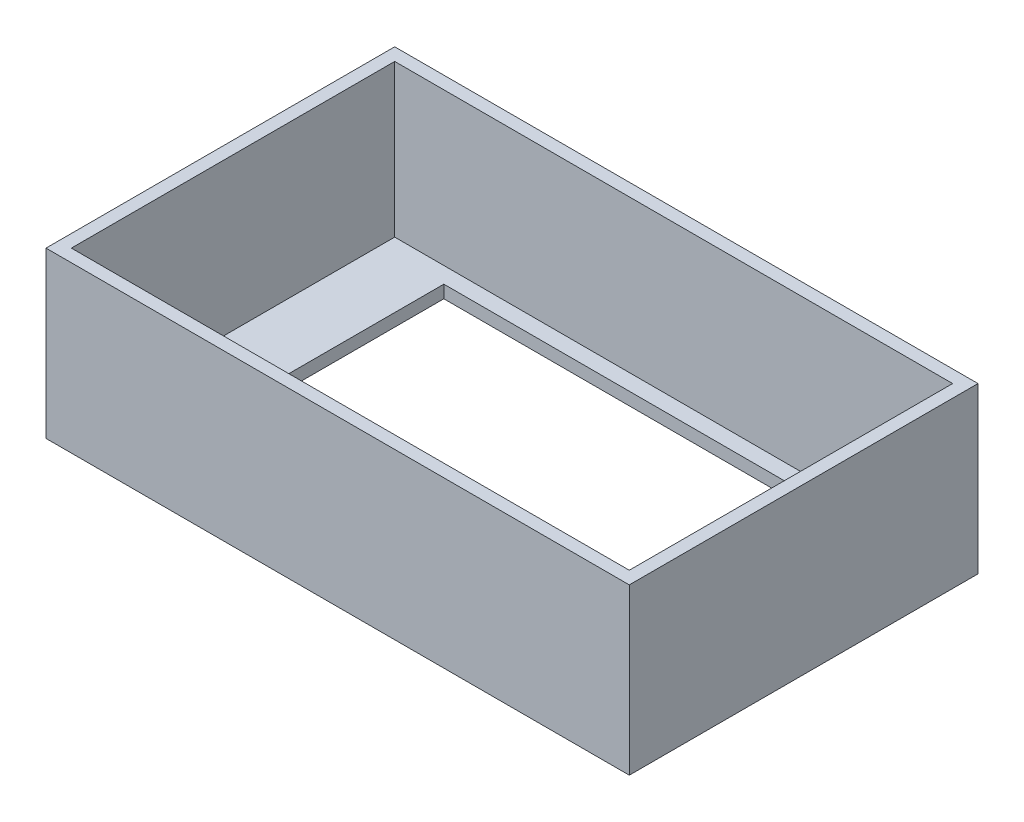
ISO-10303-21;
HEADER;
FILE_DESCRIPTION(('STEP AP214'),'2;1');
FILE_NAME('part.step','',(''),(''),'','','');
FILE_SCHEMA(('AUTOMOTIVE_DESIGN { 1 0 10303 214 1 1 1 1 }'));
ENDSEC;
DATA;
#1=APPLICATION_CONTEXT('core data for automotive mechanical design processes');
#2=APPLICATION_PROTOCOL_DEFINITION('international standard','automotive_design',2000,#1);
#3=PRODUCT_CONTEXT('',#1,'mechanical');
#4=PRODUCT('Part','Part','',(#3));
#5=PRODUCT_RELATED_PRODUCT_CATEGORY('part','',(#4));
#6=PRODUCT_DEFINITION_FORMATION('','',#4);
#7=PRODUCT_DEFINITION_CONTEXT('part definition',#1,'design');
#8=PRODUCT_DEFINITION('design','',#6,#7);
#9=PRODUCT_DEFINITION_SHAPE('','',#8);
#10=(LENGTH_UNIT() NAMED_UNIT(*) SI_UNIT(.MILLI.,.METRE.));
#11=(NAMED_UNIT(*) PLANE_ANGLE_UNIT() SI_UNIT($,.RADIAN.));
#12=(NAMED_UNIT(*) SI_UNIT($,.STERADIAN.) SOLID_ANGLE_UNIT());
#13=UNCERTAINTY_MEASURE_WITH_UNIT(LENGTH_MEASURE(1.E-05),#10,'distance_accuracy_value','');
#14=(GEOMETRIC_REPRESENTATION_CONTEXT(3) GLOBAL_UNCERTAINTY_ASSIGNED_CONTEXT((#13)) GLOBAL_UNIT_ASSIGNED_CONTEXT((#10,
#11,#12)) REPRESENTATION_CONTEXT('',''));
#15=CARTESIAN_POINT('',(0.,0.,0.));
#16=DIRECTION('',(0.,0.,1.));
#17=DIRECTION('',(1.,0.,0.));
#18=AXIS2_PLACEMENT_3D('',#15,#16,#17);
#19=CARTESIAN_POINT('',(0.,2.,0.));
#20=DIRECTION('',(0.,1.,0.));
#21=DIRECTION('',(0.,0.,1.));
#22=AXIS2_PLACEMENT_3D('',#19,#20,#21);
#23=PLANE('',#22);
#24=DIRECTION('',(0.,0.,1.));
#25=VECTOR('',#24,1.);
#26=CARTESIAN_POINT('',(-44.,2.,-25.5));
#27=LINE('',#26,#25);
#28=CARTESIAN_POINT('',(-44.,2.,-25.5));
#29=VERTEX_POINT('',#28);
#30=CARTESIAN_POINT('',(-44.,2.00000000000001,25.5));
#31=VERTEX_POINT('',#30);
#32=EDGE_CURVE('E213',#29,#31,#27,.T.);
#33=ORIENTED_EDGE('',*,*,#32,.T.);
#34=DIRECTION('',(1.,0.,0.));
#35=VECTOR('',#34,1.);
#36=CARTESIAN_POINT('',(-44.,2.,25.5));
#37=LINE('',#36,#35);
#38=CARTESIAN_POINT('',(44.,2.00000000000001,25.5));
#39=VERTEX_POINT('',#38);
#40=EDGE_CURVE('E150',#31,#39,#37,.T.);
#41=ORIENTED_EDGE('',*,*,#40,.T.);
#42=DIRECTION('',(0.,0.,-1.));
#43=VECTOR('',#42,1.);
#44=CARTESIAN_POINT('',(44.,2.,-25.5));
#45=LINE('',#44,#43);
#46=CARTESIAN_POINT('',(44.,2.00000000000001,-25.5));
#47=VERTEX_POINT('',#46);
#48=EDGE_CURVE('E51',#39,#47,#45,.T.);
#49=ORIENTED_EDGE('',*,*,#48,.T.);
#50=DIRECTION('',(-1.,0.,0.));
#51=VECTOR('',#50,1.);
#52=CARTESIAN_POINT('',(-44.,2.,-25.5));
#53=LINE('',#52,#51);
#54=EDGE_CURVE('E11',#47,#29,#53,.T.);
#55=ORIENTED_EDGE('',*,*,#54,.T.);
#56=EDGE_LOOP('',(#33,#41,#49,#55));
#57=FACE_BOUND('',#56,.T.);
#58=DIRECTION('',(1.,0.,0.));
#59=VECTOR('',#58,1.);
#60=CARTESIAN_POINT('',(-33.7,2.,22.95));
#61=LINE('',#60,#59);
#62=CARTESIAN_POINT('',(-33.7,2.,22.95));
#63=VERTEX_POINT('',#62);
#64=CARTESIAN_POINT('',(26.5,2.,22.95));
#65=VERTEX_POINT('',#64);
#66=EDGE_CURVE('E214',#63,#65,#61,.T.);
#67=ORIENTED_EDGE('',*,*,#66,.F.);
#68=DIRECTION('',(0.,0.,1.));
#69=VECTOR('',#68,1.);
#70=CARTESIAN_POINT('',(-33.7,2.,-22.95));
#71=LINE('',#70,#69);
#72=CARTESIAN_POINT('',(-33.7,2.,-22.95));
#73=VERTEX_POINT('',#72);
#74=EDGE_CURVE('E217',#73,#63,#71,.T.);
#75=ORIENTED_EDGE('',*,*,#74,.F.);
#76=DIRECTION('',(-1.,0.,0.));
#77=VECTOR('',#76,1.);
#78=CARTESIAN_POINT('',(-33.7,2.,-22.95));
#79=LINE('',#78,#77);
#80=CARTESIAN_POINT('',(26.5,2.,-22.95));
#81=VERTEX_POINT('',#80);
#82=EDGE_CURVE('E201',#81,#73,#79,.T.);
#83=ORIENTED_EDGE('',*,*,#82,.F.);
#84=DIRECTION('',(0.,0.,-1.));
#85=VECTOR('',#84,1.);
#86=CARTESIAN_POINT('',(26.5,2.,-22.95));
#87=LINE('',#86,#85);
#88=EDGE_CURVE('E58',#65,#81,#87,.T.);
#89=ORIENTED_EDGE('',*,*,#88,.F.);
#90=EDGE_LOOP('',(#67,#75,#83,#89));
#91=FACE_BOUND('',#90,.T.);
#92=ADVANCED_FACE('F43',(#57,#91),#23,.T.);
#93=CARTESIAN_POINT('',(0.,0.,0.));
#94=DIRECTION('',(0.,1.,0.));
#95=DIRECTION('',(0.,0.,1.));
#96=AXIS2_PLACEMENT_3D('',#93,#94,#95);
#97=PLANE('',#96);
#98=DIRECTION('',(0.,0.,1.));
#99=VECTOR('',#98,1.);
#100=CARTESIAN_POINT('',(-33.7,0.,-22.95));
#101=LINE('',#100,#99);
#102=CARTESIAN_POINT('',(-33.7,0.,-22.95));
#103=VERTEX_POINT('',#102);
#104=CARTESIAN_POINT('',(-33.7,0.,22.95));
#105=VERTEX_POINT('',#104);
#106=EDGE_CURVE('E66',#103,#105,#101,.T.);
#107=ORIENTED_EDGE('',*,*,#106,.T.);
#108=DIRECTION('',(1.,0.,0.));
#109=VECTOR('',#108,1.);
#110=CARTESIAN_POINT('',(-33.7,0.,22.95));
#111=LINE('',#110,#109);
#112=CARTESIAN_POINT('',(26.5,0.,22.95));
#113=VERTEX_POINT('',#112);
#114=EDGE_CURVE('E207',#105,#113,#111,.T.);
#115=ORIENTED_EDGE('',*,*,#114,.T.);
#116=DIRECTION('',(0.,0.,-1.));
#117=VECTOR('',#116,1.);
#118=CARTESIAN_POINT('',(26.5,0.,-22.95));
#119=LINE('',#118,#117);
#120=CARTESIAN_POINT('',(26.5,0.,-22.95));
#121=VERTEX_POINT('',#120);
#122=EDGE_CURVE('E203',#113,#121,#119,.T.);
#123=ORIENTED_EDGE('',*,*,#122,.T.);
#124=DIRECTION('',(-1.,0.,0.));
#125=VECTOR('',#124,1.);
#126=CARTESIAN_POINT('',(-33.7,0.,-22.95));
#127=LINE('',#126,#125);
#128=EDGE_CURVE('E198',#121,#103,#127,.T.);
#129=ORIENTED_EDGE('',*,*,#128,.T.);
#130=EDGE_LOOP('',(#107,#115,#123,#129));
#131=FACE_BOUND('',#130,.T.);
#132=DIRECTION('',(-1.,0.,0.));
#133=VECTOR('',#132,1.);
#134=CARTESIAN_POINT('',(46.,0.,-27.5));
#135=LINE('',#134,#133);
#136=CARTESIAN_POINT('',(46.,0.,-27.5));
#137=VERTEX_POINT('',#136);
#138=CARTESIAN_POINT('',(-46.,0.,-27.5));
#139=VERTEX_POINT('',#138);
#140=EDGE_CURVE('E151',#137,#139,#135,.T.);
#141=ORIENTED_EDGE('',*,*,#140,.F.);
#142=DIRECTION('',(0.,0.,-1.));
#143=VECTOR('',#142,1.);
#144=CARTESIAN_POINT('',(46.,0.,27.5));
#145=LINE('',#144,#143);
#146=CARTESIAN_POINT('',(46.,0.,27.5));
#147=VERTEX_POINT('',#146);
#148=EDGE_CURVE('E172',#147,#137,#145,.T.);
#149=ORIENTED_EDGE('',*,*,#148,.F.);
#150=DIRECTION('',(1.,0.,0.));
#151=VECTOR('',#150,1.);
#152=CARTESIAN_POINT('',(-46.,0.,27.5));
#153=LINE('',#152,#151);
#154=CARTESIAN_POINT('',(-46.,0.,27.5));
#155=VERTEX_POINT('',#154);
#156=EDGE_CURVE('E183',#155,#147,#153,.T.);
#157=ORIENTED_EDGE('',*,*,#156,.F.);
#158=DIRECTION('',(0.,0.,1.));
#159=VECTOR('',#158,1.);
#160=CARTESIAN_POINT('',(-46.,0.,-27.5));
#161=LINE('',#160,#159);
#162=EDGE_CURVE('E181',#139,#155,#161,.T.);
#163=ORIENTED_EDGE('',*,*,#162,.F.);
#164=EDGE_LOOP('',(#141,#149,#157,#163));
#165=FACE_BOUND('',#164,.T.);
#166=ADVANCED_FACE('F45',(#131,#165),#97,.F.);
#167=CARTESIAN_POINT('',(-33.7,77.70237776979,-22.95));
#168=DIRECTION('',(1.,0.,0.));
#169=DIRECTION('',(0.,0.,-1.));
#170=AXIS2_PLACEMENT_3D('',#167,#168,#169);
#171=PLANE('',#170);
#172=ORIENTED_EDGE('',*,*,#74,.T.);
#173=DIRECTION('',(0.,-1.,0.));
#174=VECTOR('',#173,1.);
#175=CARTESIAN_POINT('',(-33.7,77.70237776979,22.95));
#176=LINE('',#175,#174);
#177=EDGE_CURVE('E210',#63,#105,#176,.T.);
#178=ORIENTED_EDGE('',*,*,#177,.T.);
#179=ORIENTED_EDGE('',*,*,#106,.F.);
#180=DIRECTION('',(0.,-1.,0.));
#181=VECTOR('',#180,1.);
#182=CARTESIAN_POINT('',(-33.7,77.70237776979,-22.95));
#183=LINE('',#182,#181);
#184=EDGE_CURVE('E197',#73,#103,#183,.T.);
#185=ORIENTED_EDGE('',*,*,#184,.F.);
#186=EDGE_LOOP('',(#172,#178,#179,#185));
#187=FACE_BOUND('',#186,.T.);
#188=ADVANCED_FACE('F244',(#187),#171,.T.);
#189=CARTESIAN_POINT('',(-33.7,77.70237776979,22.95));
#190=DIRECTION('',(0.,0.,-1.));
#191=DIRECTION('',(-1.,0.,0.));
#192=AXIS2_PLACEMENT_3D('',#189,#190,#191);
#193=PLANE('',#192);
#194=ORIENTED_EDGE('',*,*,#66,.T.);
#195=DIRECTION('',(0.,-1.,0.));
#196=VECTOR('',#195,1.);
#197=CARTESIAN_POINT('',(26.5,77.70237776979,22.95));
#198=LINE('',#197,#196);
#199=EDGE_CURVE('E206',#65,#113,#198,.T.);
#200=ORIENTED_EDGE('',*,*,#199,.T.);
#201=ORIENTED_EDGE('',*,*,#114,.F.);
#202=ORIENTED_EDGE('',*,*,#177,.F.);
#203=EDGE_LOOP('',(#194,#200,#201,#202));
#204=FACE_BOUND('',#203,.T.);
#205=ADVANCED_FACE('F249',(#204),#193,.T.);
#206=CARTESIAN_POINT('',(26.5,77.70237776979,-22.95));
#207=DIRECTION('',(-1.,0.,0.));
#208=DIRECTION('',(0.,0.,1.));
#209=AXIS2_PLACEMENT_3D('',#206,#207,#208);
#210=PLANE('',#209);
#211=ORIENTED_EDGE('',*,*,#88,.T.);
#212=DIRECTION('',(0.,-1.,0.));
#213=VECTOR('',#212,1.);
#214=CARTESIAN_POINT('',(26.5,77.70237776979,-22.95));
#215=LINE('',#214,#213);
#216=EDGE_CURVE('E202',#81,#121,#215,.T.);
#217=ORIENTED_EDGE('',*,*,#216,.T.);
#218=ORIENTED_EDGE('',*,*,#122,.F.);
#219=ORIENTED_EDGE('',*,*,#199,.F.);
#220=EDGE_LOOP('',(#211,#217,#218,#219));
#221=FACE_BOUND('',#220,.T.);
#222=ADVANCED_FACE('F252',(#221),#210,.T.);
#223=CARTESIAN_POINT('',(-33.7,77.70237776979,-22.95));
#224=DIRECTION('',(0.,0.,1.));
#225=DIRECTION('',(1.,0.,0.));
#226=AXIS2_PLACEMENT_3D('',#223,#224,#225);
#227=PLANE('',#226);
#228=ORIENTED_EDGE('',*,*,#82,.T.);
#229=ORIENTED_EDGE('',*,*,#184,.T.);
#230=ORIENTED_EDGE('',*,*,#128,.F.);
#231=ORIENTED_EDGE('',*,*,#216,.F.);
#232=EDGE_LOOP('',(#228,#229,#230,#231));
#233=FACE_BOUND('',#232,.T.);
#234=ADVANCED_FACE('F256',(#233),#227,.T.);
#235=CARTESIAN_POINT('',(0.,26.,0.));
#236=DIRECTION('',(0.,1.,0.));
#237=DIRECTION('',(0.,0.,1.));
#238=AXIS2_PLACEMENT_3D('',#235,#236,#237);
#239=PLANE('',#238);
#240=DIRECTION('',(-1.,0.,0.));
#241=VECTOR('',#240,1.);
#242=CARTESIAN_POINT('',(46.,26.,-27.5));
#243=LINE('',#242,#241);
#244=CARTESIAN_POINT('',(46.,26.,-27.5));
#245=VERTEX_POINT('',#244);
#246=CARTESIAN_POINT('',(-46.,26.,-27.5));
#247=VERTEX_POINT('',#246);
#248=EDGE_CURVE('E168',#245,#247,#243,.T.);
#249=ORIENTED_EDGE('',*,*,#248,.T.);
#250=DIRECTION('',(0.,0.,1.));
#251=VECTOR('',#250,1.);
#252=CARTESIAN_POINT('',(-46.,26.,-27.5));
#253=LINE('',#252,#251);
#254=CARTESIAN_POINT('',(-46.,26.,27.5));
#255=VERTEX_POINT('',#254);
#256=EDGE_CURVE('E171',#247,#255,#253,.T.);
#257=ORIENTED_EDGE('',*,*,#256,.T.);
#258=DIRECTION('',(1.,0.,0.));
#259=VECTOR('',#258,1.);
#260=CARTESIAN_POINT('',(-46.,26.,27.5));
#261=LINE('',#260,#259);
#262=CARTESIAN_POINT('',(46.,26.,27.5));
#263=VERTEX_POINT('',#262);
#264=EDGE_CURVE('E174',#255,#263,#261,.T.);
#265=ORIENTED_EDGE('',*,*,#264,.T.);
#266=DIRECTION('',(0.,0.,-1.));
#267=VECTOR('',#266,1.);
#268=CARTESIAN_POINT('',(46.,26.,27.5));
#269=LINE('',#268,#267);
#270=EDGE_CURVE('E176',#263,#245,#269,.T.);
#271=ORIENTED_EDGE('',*,*,#270,.T.);
#272=EDGE_LOOP('',(#249,#257,#265,#271));
#273=FACE_BOUND('',#272,.T.);
#274=DIRECTION('',(1.,0.,0.));
#275=VECTOR('',#274,1.);
#276=CARTESIAN_POINT('',(-44.,26.,25.5));
#277=LINE('',#276,#275);
#278=CARTESIAN_POINT('',(-44.,26.,25.5));
#279=VERTEX_POINT('',#278);
#280=CARTESIAN_POINT('',(44.,26.,25.5));
#281=VERTEX_POINT('',#280);
#282=EDGE_CURVE('E143',#279,#281,#277,.T.);
#283=ORIENTED_EDGE('',*,*,#282,.F.);
#284=DIRECTION('',(0.,0.,1.));
#285=VECTOR('',#284,1.);
#286=CARTESIAN_POINT('',(-44.,26.,-25.5));
#287=LINE('',#286,#285);
#288=CARTESIAN_POINT('',(-44.,26.,-25.5));
#289=VERTEX_POINT('',#288);
#290=EDGE_CURVE('E133',#289,#279,#287,.T.);
#291=ORIENTED_EDGE('',*,*,#290,.F.);
#292=DIRECTION('',(-1.,0.,0.));
#293=VECTOR('',#292,1.);
#294=CARTESIAN_POINT('',(44.,26.,-25.5));
#295=LINE('',#294,#293);
#296=CARTESIAN_POINT('',(44.,26.,-25.5));
#297=VERTEX_POINT('',#296);
#298=EDGE_CURVE('E159',#297,#289,#295,.T.);
#299=ORIENTED_EDGE('',*,*,#298,.F.);
#300=DIRECTION('',(0.,0.,-1.));
#301=VECTOR('',#300,1.);
#302=CARTESIAN_POINT('',(44.,26.,25.5));
#303=LINE('',#302,#301);
#304=EDGE_CURVE('E157',#281,#297,#303,.T.);
#305=ORIENTED_EDGE('',*,*,#304,.F.);
#306=EDGE_LOOP('',(#283,#291,#299,#305));
#307=FACE_BOUND('',#306,.T.);
#308=ADVANCED_FACE('F155',(#273,#307),#239,.T.);
#309=CARTESIAN_POINT('',(46.,26.,-27.5));
#310=DIRECTION('',(0.,0.,1.));
#311=DIRECTION('',(1.,0.,0.));
#312=AXIS2_PLACEMENT_3D('',#309,#310,#311);
#313=PLANE('',#312);
#314=ORIENTED_EDGE('',*,*,#140,.T.);
#315=DIRECTION('',(0.,-1.,0.));
#316=VECTOR('',#315,1.);
#317=CARTESIAN_POINT('',(-46.,26.,-27.5));
#318=LINE('',#317,#316);
#319=EDGE_CURVE('E194',#247,#139,#318,.T.);
#320=ORIENTED_EDGE('',*,*,#319,.F.);
#321=ORIENTED_EDGE('',*,*,#248,.F.);
#322=DIRECTION('',(0.,-1.,0.));
#323=VECTOR('',#322,1.);
#324=CARTESIAN_POINT('',(46.,26.,-27.5));
#325=LINE('',#324,#323);
#326=EDGE_CURVE('E178',#245,#137,#325,.T.);
#327=ORIENTED_EDGE('',*,*,#326,.T.);
#328=EDGE_LOOP('',(#314,#320,#321,#327));
#329=FACE_BOUND('',#328,.T.);
#330=ADVANCED_FACE('F260',(#329),#313,.F.);
#331=CARTESIAN_POINT('',(-46.,26.,-27.5));
#332=DIRECTION('',(1.,0.,0.));
#333=DIRECTION('',(0.,0.,-1.));
#334=AXIS2_PLACEMENT_3D('',#331,#332,#333);
#335=PLANE('',#334);
#336=ORIENTED_EDGE('',*,*,#162,.T.);
#337=DIRECTION('',(0.,-1.,0.));
#338=VECTOR('',#337,1.);
#339=CARTESIAN_POINT('',(-46.,26.,27.5));
#340=LINE('',#339,#338);
#341=EDGE_CURVE('E191',#255,#155,#340,.T.);
#342=ORIENTED_EDGE('',*,*,#341,.F.);
#343=ORIENTED_EDGE('',*,*,#256,.F.);
#344=ORIENTED_EDGE('',*,*,#319,.T.);
#345=EDGE_LOOP('',(#336,#342,#343,#344));
#346=FACE_BOUND('',#345,.T.);
#347=ADVANCED_FACE('F263',(#346),#335,.F.);
#348=CARTESIAN_POINT('',(-46.,26.,27.5));
#349=DIRECTION('',(0.,0.,-1.));
#350=DIRECTION('',(-1.,0.,0.));
#351=AXIS2_PLACEMENT_3D('',#348,#349,#350);
#352=PLANE('',#351);
#353=ORIENTED_EDGE('',*,*,#156,.T.);
#354=DIRECTION('',(0.,-1.,0.));
#355=VECTOR('',#354,1.);
#356=CARTESIAN_POINT('',(46.,26.,27.5));
#357=LINE('',#356,#355);
#358=EDGE_CURVE('E188',#263,#147,#357,.T.);
#359=ORIENTED_EDGE('',*,*,#358,.F.);
#360=ORIENTED_EDGE('',*,*,#264,.F.);
#361=ORIENTED_EDGE('',*,*,#341,.T.);
#362=EDGE_LOOP('',(#353,#359,#360,#361));
#363=FACE_BOUND('',#362,.T.);
#364=ADVANCED_FACE('F267',(#363),#352,.F.);
#365=CARTESIAN_POINT('',(46.,26.,27.5));
#366=DIRECTION('',(-1.,0.,0.));
#367=DIRECTION('',(0.,0.,1.));
#368=AXIS2_PLACEMENT_3D('',#365,#366,#367);
#369=PLANE('',#368);
#370=ORIENTED_EDGE('',*,*,#148,.T.);
#371=ORIENTED_EDGE('',*,*,#326,.F.);
#372=ORIENTED_EDGE('',*,*,#270,.F.);
#373=ORIENTED_EDGE('',*,*,#358,.T.);
#374=EDGE_LOOP('',(#370,#371,#372,#373));
#375=FACE_BOUND('',#374,.T.);
#376=ADVANCED_FACE('F271',(#375),#369,.F.);
#377=CARTESIAN_POINT('',(-44.,26.,-25.5));
#378=DIRECTION('',(1.,0.,0.));
#379=DIRECTION('',(0.,0.,-1.));
#380=AXIS2_PLACEMENT_3D('',#377,#378,#379);
#381=PLANE('',#380);
#382=DIRECTION('',(0.,-1.,0.));
#383=VECTOR('',#382,1.);
#384=CARTESIAN_POINT('',(-44.,26.,25.5));
#385=LINE('',#384,#383);
#386=EDGE_CURVE('E137',#279,#31,#385,.T.);
#387=ORIENTED_EDGE('',*,*,#386,.T.);
#388=ORIENTED_EDGE('',*,*,#32,.F.);
#389=DIRECTION('',(0.,-1.,0.));
#390=VECTOR('',#389,1.);
#391=CARTESIAN_POINT('',(-44.,26.,-25.5));
#392=LINE('',#391,#390);
#393=EDGE_CURVE('E139',#289,#29,#392,.T.);
#394=ORIENTED_EDGE('',*,*,#393,.F.);
#395=ORIENTED_EDGE('',*,*,#290,.T.);
#396=EDGE_LOOP('',(#387,#388,#394,#395));
#397=FACE_BOUND('',#396,.T.);
#398=ADVANCED_FACE('F135',(#397),#381,.T.);
#399=CARTESIAN_POINT('',(-44.,26.,25.5));
#400=DIRECTION('',(0.,0.,-1.));
#401=DIRECTION('',(-1.,0.,0.));
#402=AXIS2_PLACEMENT_3D('',#399,#400,#401);
#403=PLANE('',#402);
#404=DIRECTION('',(0.,-1.,0.));
#405=VECTOR('',#404,1.);
#406=CARTESIAN_POINT('',(44.,26.,25.5));
#407=LINE('',#406,#405);
#408=EDGE_CURVE('E152',#281,#39,#407,.T.);
#409=ORIENTED_EDGE('',*,*,#408,.T.);
#410=ORIENTED_EDGE('',*,*,#40,.F.);
#411=ORIENTED_EDGE('',*,*,#386,.F.);
#412=ORIENTED_EDGE('',*,*,#282,.T.);
#413=EDGE_LOOP('',(#409,#410,#411,#412));
#414=FACE_BOUND('',#413,.T.);
#415=ADVANCED_FACE('F147',(#414),#403,.T.);
#416=CARTESIAN_POINT('',(44.,26.,25.5));
#417=DIRECTION('',(-1.,0.,0.));
#418=DIRECTION('',(0.,0.,1.));
#419=AXIS2_PLACEMENT_3D('',#416,#417,#418);
#420=PLANE('',#419);
#421=DIRECTION('',(0.,-1.,0.));
#422=VECTOR('',#421,1.);
#423=CARTESIAN_POINT('',(44.,26.,-25.5));
#424=LINE('',#423,#422);
#425=EDGE_CURVE('E164',#297,#47,#424,.T.);
#426=ORIENTED_EDGE('',*,*,#425,.T.);
#427=ORIENTED_EDGE('',*,*,#48,.F.);
#428=ORIENTED_EDGE('',*,*,#408,.F.);
#429=ORIENTED_EDGE('',*,*,#304,.T.);
#430=EDGE_LOOP('',(#426,#427,#428,#429));
#431=FACE_BOUND('',#430,.T.);
#432=ADVANCED_FACE('F231',(#431),#420,.T.);
#433=CARTESIAN_POINT('',(44.,26.,-25.5));
#434=DIRECTION('',(0.,0.,1.));
#435=DIRECTION('',(1.,0.,0.));
#436=AXIS2_PLACEMENT_3D('',#433,#434,#435);
#437=PLANE('',#436);
#438=ORIENTED_EDGE('',*,*,#393,.T.);
#439=ORIENTED_EDGE('',*,*,#54,.F.);
#440=ORIENTED_EDGE('',*,*,#425,.F.);
#441=ORIENTED_EDGE('',*,*,#298,.T.);
#442=EDGE_LOOP('',(#438,#439,#440,#441));
#443=FACE_BOUND('',#442,.T.);
#444=ADVANCED_FACE('F233',(#443),#437,.T.);
#445=CLOSED_SHELL('',(#92,#166,#188,#205,#222,#234,#308,#330,#347,#364,#376,#398,#415,#432,#444));
#446=MANIFOLD_SOLID_BREP('B2',#445);
#447=ADVANCED_BREP_SHAPE_REPRESENTATION('',(#18,#446),#14);
#448=SHAPE_DEFINITION_REPRESENTATION(#9,#447);
ENDSEC;
END-ISO-10303-21;
